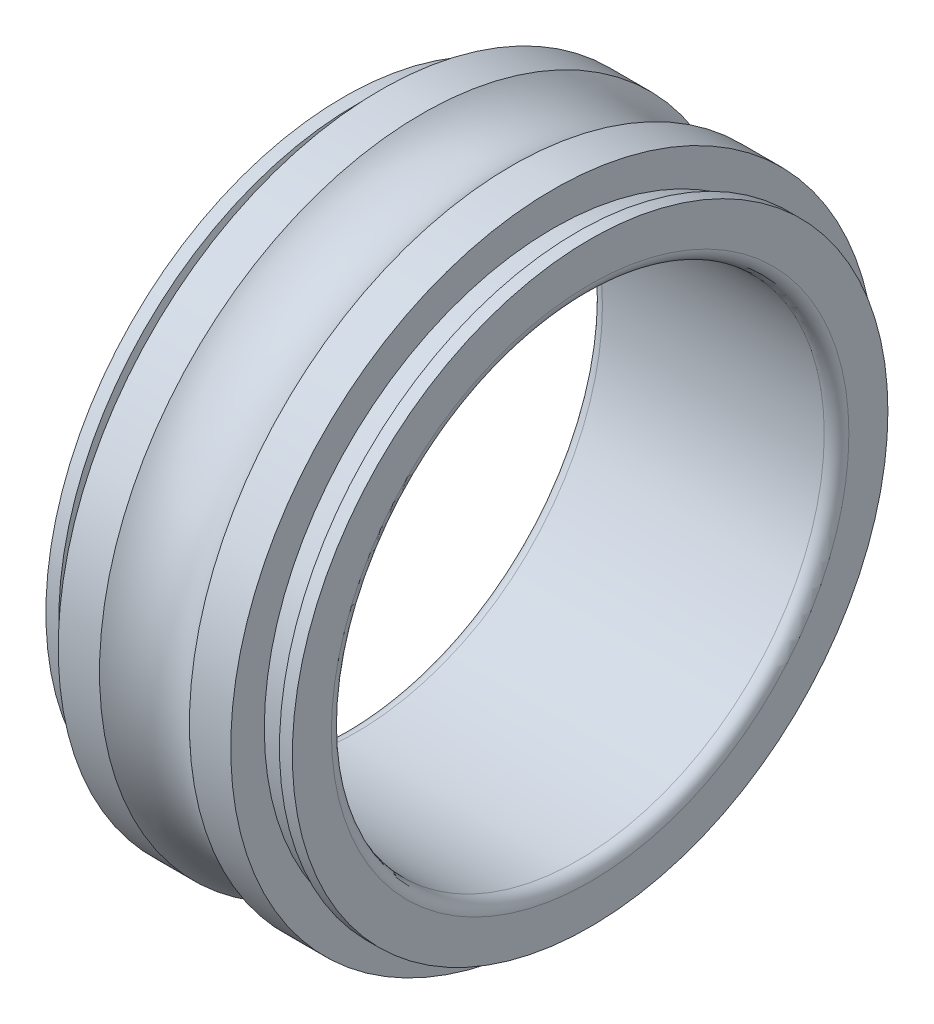
ISO-10303-21;
HEADER;
FILE_DESCRIPTION(('STEP AP214'),'2;1');
FILE_NAME('part.step','',(''),(''),'','','');
FILE_SCHEMA(('AUTOMOTIVE_DESIGN { 1 0 10303 214 1 1 1 1 }'));
ENDSEC;
DATA;
#1=APPLICATION_CONTEXT('core data for automotive mechanical design processes');
#2=APPLICATION_PROTOCOL_DEFINITION('international standard','automotive_design',2000,#1);
#3=PRODUCT_CONTEXT('',#1,'mechanical');
#4=PRODUCT('Part','Part','',(#3));
#5=PRODUCT_RELATED_PRODUCT_CATEGORY('part','',(#4));
#6=PRODUCT_DEFINITION_FORMATION('','',#4);
#7=PRODUCT_DEFINITION_CONTEXT('part definition',#1,'design');
#8=PRODUCT_DEFINITION('design','',#6,#7);
#9=PRODUCT_DEFINITION_SHAPE('','',#8);
#10=(LENGTH_UNIT() NAMED_UNIT(*) SI_UNIT(.MILLI.,.METRE.));
#11=(NAMED_UNIT(*) PLANE_ANGLE_UNIT() SI_UNIT($,.RADIAN.));
#12=(NAMED_UNIT(*) SI_UNIT($,.STERADIAN.) SOLID_ANGLE_UNIT());
#13=UNCERTAINTY_MEASURE_WITH_UNIT(LENGTH_MEASURE(1.E-05),#10,'distance_accuracy_value','');
#14=(GEOMETRIC_REPRESENTATION_CONTEXT(3) GLOBAL_UNCERTAINTY_ASSIGNED_CONTEXT((#13)) GLOBAL_UNIT_ASSIGNED_CONTEXT((#10,
#11,#12)) REPRESENTATION_CONTEXT('',''));
#15=CARTESIAN_POINT('',(0.,0.,0.));
#16=DIRECTION('',(0.,0.,1.));
#17=DIRECTION('',(1.,0.,0.));
#18=AXIS2_PLACEMENT_3D('',#15,#16,#17);
#19=CARTESIAN_POINT('',(0.,7.25,0.));
#20=DIRECTION('',(-1.,0.,0.));
#21=DIRECTION('',(0.,0.,1.));
#22=AXIS2_PLACEMENT_3D('',#19,#20,#21);
#23=PLANE('',#22);
#24=CARTESIAN_POINT('',(0.,0.,0.));
#25=DIRECTION('',(1.,0.,0.));
#26=DIRECTION('',(0.,0.,-1.));
#27=AXIS2_PLACEMENT_3D('',#24,#25,#26);
#28=CIRCLE('',#27,6.3);
#29=CARTESIAN_POINT('',(0.,0.,-6.3));
#30=VERTEX_POINT('',#29);
#31=EDGE_CURVE('E70',#30,#30,#28,.T.);
#32=ORIENTED_EDGE('',*,*,#31,.T.);
#33=EDGE_LOOP('',(#32));
#34=FACE_BOUND('',#33,.T.);
#35=CARTESIAN_POINT('',(0.,0.,0.));
#36=DIRECTION('',(1.,0.,0.));
#37=DIRECTION('',(0.,0.,-1.));
#38=AXIS2_PLACEMENT_3D('',#35,#36,#37);
#39=CIRCLE('',#38,7.25);
#40=CARTESIAN_POINT('',(0.,0.,-7.25));
#41=VERTEX_POINT('',#40);
#42=EDGE_CURVE('E63',#41,#41,#39,.T.);
#43=ORIENTED_EDGE('',*,*,#42,.F.);
#44=EDGE_LOOP('',(#43));
#45=FACE_BOUND('',#44,.T.);
#46=ADVANCED_FACE('F14',(#34,#45),#23,.T.);
#47=CARTESIAN_POINT('',(0.299999999999939,0.,0.));
#48=DIRECTION('',(1.,0.,0.));
#49=DIRECTION('',(0.,0.,-1.));
#50=AXIS2_PLACEMENT_3D('',#47,#48,#49);
#51=TOROIDAL_SURFACE('',#50,6.3,0.299999999999939);
#52=CARTESIAN_POINT('',(0.3,0.,0.));
#53=DIRECTION('',(1.,0.,0.));
#54=DIRECTION('',(0.,0.,-1.));
#55=AXIS2_PLACEMENT_3D('',#52,#53,#54);
#56=CIRCLE('',#55,6.);
#57=CARTESIAN_POINT('',(0.3,0.,-6.));
#58=VERTEX_POINT('',#57);
#59=EDGE_CURVE('E61',#58,#58,#56,.T.);
#60=ORIENTED_EDGE('',*,*,#59,.T.);
#61=EDGE_LOOP('',(#60));
#62=FACE_BOUND('',#61,.T.);
#63=ORIENTED_EDGE('',*,*,#31,.F.);
#64=EDGE_LOOP('',(#63));
#65=FACE_BOUND('',#64,.T.);
#66=ADVANCED_FACE('F73',(#62,#65),#51,.T.);
#67=CARTESIAN_POINT('',(6.,0.,0.));
#68=DIRECTION('',(1.,0.,0.));
#69=DIRECTION('',(0.,0.,-1.));
#70=AXIS2_PLACEMENT_3D('',#67,#68,#69);
#71=CYLINDRICAL_SURFACE('',#70,6.);
#72=CARTESIAN_POINT('',(5.7,0.,0.));
#73=DIRECTION('',(1.,0.,0.));
#74=DIRECTION('',(0.,0.,-1.));
#75=AXIS2_PLACEMENT_3D('',#72,#73,#74);
#76=CIRCLE('',#75,6.);
#77=CARTESIAN_POINT('',(5.7,0.,-6.));
#78=VERTEX_POINT('',#77);
#79=EDGE_CURVE('E59',#78,#78,#76,.T.);
#80=ORIENTED_EDGE('',*,*,#79,.T.);
#81=EDGE_LOOP('',(#80));
#82=FACE_BOUND('',#81,.T.);
#83=ORIENTED_EDGE('',*,*,#59,.F.);
#84=EDGE_LOOP('',(#83));
#85=FACE_BOUND('',#84,.T.);
#86=ADVANCED_FACE('F74',(#82,#85),#71,.F.);
#87=CARTESIAN_POINT('',(5.70000000000012,0.,0.));
#88=DIRECTION('',(1.,0.,0.));
#89=DIRECTION('',(0.,0.,-1.));
#90=AXIS2_PLACEMENT_3D('',#87,#88,#89);
#91=TOROIDAL_SURFACE('',#90,6.29999999999988,0.299999999999876);
#92=CARTESIAN_POINT('',(6.,0.,0.));
#93=DIRECTION('',(1.,0.,0.));
#94=DIRECTION('',(0.,0.,-1.));
#95=AXIS2_PLACEMENT_3D('',#92,#93,#94);
#96=CIRCLE('',#95,6.29999999999988);
#97=CARTESIAN_POINT('',(6.,0.,-6.29999999999988));
#98=VERTEX_POINT('',#97);
#99=EDGE_CURVE('E54',#98,#98,#96,.T.);
#100=ORIENTED_EDGE('',*,*,#99,.T.);
#101=EDGE_LOOP('',(#100));
#102=FACE_BOUND('',#101,.T.);
#103=ORIENTED_EDGE('',*,*,#79,.F.);
#104=EDGE_LOOP('',(#103));
#105=FACE_BOUND('',#104,.T.);
#106=ADVANCED_FACE('F84',(#102,#105),#91,.T.);
#107=CARTESIAN_POINT('',(6.,6.3,0.));
#108=DIRECTION('',(1.,0.,0.));
#109=DIRECTION('',(0.,0.,-1.));
#110=AXIS2_PLACEMENT_3D('',#107,#108,#109);
#111=PLANE('',#110);
#112=CARTESIAN_POINT('',(6.,0.,0.));
#113=DIRECTION('',(1.,0.,0.));
#114=DIRECTION('',(0.,0.,-1.));
#115=AXIS2_PLACEMENT_3D('',#112,#113,#114);
#116=CIRCLE('',#115,7.25);
#117=CARTESIAN_POINT('',(6.,0.,-7.25));
#118=VERTEX_POINT('',#117);
#119=EDGE_CURVE('E55',#118,#118,#116,.T.);
#120=ORIENTED_EDGE('',*,*,#119,.T.);
#121=EDGE_LOOP('',(#120));
#122=FACE_BOUND('',#121,.T.);
#123=ORIENTED_EDGE('',*,*,#99,.F.);
#124=EDGE_LOOP('',(#123));
#125=FACE_BOUND('',#124,.T.);
#126=ADVANCED_FACE('F89',(#122,#125),#111,.T.);
#127=CARTESIAN_POINT('',(6.,0.,0.));
#128=DIRECTION('',(1.,0.,0.));
#129=DIRECTION('',(0.,0.,-1.));
#130=AXIS2_PLACEMENT_3D('',#127,#128,#129);
#131=CYLINDRICAL_SURFACE('',#130,7.25);
#132=CARTESIAN_POINT('',(5.6868911086754,0.,0.));
#133=DIRECTION('',(1.,0.,0.));
#134=DIRECTION('',(0.,0.,-1.));
#135=AXIS2_PLACEMENT_3D('',#132,#133,#134);
#136=CIRCLE('',#135,7.25);
#137=CARTESIAN_POINT('',(5.6868911086754,0.,-7.25));
#138=VERTEX_POINT('',#137);
#139=EDGE_CURVE('E47',#138,#138,#136,.T.);
#140=ORIENTED_EDGE('',*,*,#139,.T.);
#141=EDGE_LOOP('',(#140));
#142=FACE_BOUND('',#141,.T.);
#143=ORIENTED_EDGE('',*,*,#119,.F.);
#144=EDGE_LOOP('',(#143));
#145=FACE_BOUND('',#144,.T.);
#146=ADVANCED_FACE('F94',(#142,#145),#131,.T.);
#147=CARTESIAN_POINT('',(5.6868911086754,0.,0.));
#148=DIRECTION('',(1.,0.,0.));
#149=DIRECTION('',(0.,0.,-1.));
#150=AXIS2_PLACEMENT_3D('',#147,#148,#149);
#151=CONICAL_SURFACE('',#150,7.25,1.30899693899604);
#152=CARTESIAN_POINT('',(5.6286121593217,0.,0.));
#153=DIRECTION('',(1.,0.,0.));
#154=DIRECTION('',(0.,0.,-1.));
#155=AXIS2_PLACEMENT_3D('',#152,#153,#154);
#156=CIRCLE('',#155,7.0325);
#157=CARTESIAN_POINT('',(5.6286121593217,0.,-7.0325));
#158=VERTEX_POINT('',#157);
#159=EDGE_CURVE('E46',#158,#158,#156,.T.);
#160=ORIENTED_EDGE('',*,*,#159,.T.);
#161=EDGE_LOOP('',(#160));
#162=FACE_BOUND('',#161,.T.);
#163=ORIENTED_EDGE('',*,*,#139,.F.);
#164=EDGE_LOOP('',(#163));
#165=FACE_BOUND('',#164,.T.);
#166=ADVANCED_FACE('F98',(#162,#165),#151,.T.);
#167=CARTESIAN_POINT('',(6.,0.,0.));
#168=DIRECTION('',(1.,0.,0.));
#169=DIRECTION('',(0.,0.,-1.));
#170=AXIS2_PLACEMENT_3D('',#167,#168,#169);
#171=CYLINDRICAL_SURFACE('',#170,7.0325);
#172=CARTESIAN_POINT('',(5.1,0.,0.));
#173=DIRECTION('',(1.,0.,0.));
#174=DIRECTION('',(0.,0.,-1.));
#175=AXIS2_PLACEMENT_3D('',#172,#173,#174);
#176=CIRCLE('',#175,7.0325);
#177=CARTESIAN_POINT('',(5.1,0.,-7.0325));
#178=VERTEX_POINT('',#177);
#179=EDGE_CURVE('E43',#178,#178,#176,.T.);
#180=ORIENTED_EDGE('',*,*,#179,.T.);
#181=EDGE_LOOP('',(#180));
#182=FACE_BOUND('',#181,.T.);
#183=ORIENTED_EDGE('',*,*,#159,.F.);
#184=EDGE_LOOP('',(#183));
#185=FACE_BOUND('',#184,.T.);
#186=ADVANCED_FACE('F105',(#182,#185),#171,.T.);
#187=CARTESIAN_POINT('',(5.1,7.0325,0.));
#188=DIRECTION('',(1.,0.,0.));
#189=DIRECTION('',(0.,0.,-1.));
#190=AXIS2_PLACEMENT_3D('',#187,#188,#189);
#191=PLANE('',#190);
#192=CARTESIAN_POINT('',(5.1,0.,0.));
#193=DIRECTION('',(1.,0.,0.));
#194=DIRECTION('',(0.,0.,-1.));
#195=AXIS2_PLACEMENT_3D('',#192,#193,#194);
#196=CIRCLE('',#195,7.85);
#197=CARTESIAN_POINT('',(5.1,0.,-7.85));
#198=VERTEX_POINT('',#197);
#199=EDGE_CURVE('E37',#198,#198,#196,.T.);
#200=ORIENTED_EDGE('',*,*,#199,.T.);
#201=EDGE_LOOP('',(#200));
#202=FACE_BOUND('',#201,.T.);
#203=ORIENTED_EDGE('',*,*,#179,.F.);
#204=EDGE_LOOP('',(#203));
#205=FACE_BOUND('',#204,.T.);
#206=ADVANCED_FACE('F106',(#202,#205),#191,.T.);
#207=CARTESIAN_POINT('',(6.,0.,0.));
#208=DIRECTION('',(1.,0.,0.));
#209=DIRECTION('',(0.,0.,-1.));
#210=AXIS2_PLACEMENT_3D('',#207,#208,#209);
#211=CYLINDRICAL_SURFACE('',#210,7.85);
#212=CARTESIAN_POINT('',(4.0943748215305,0.,0.));
#213=DIRECTION('',(1.,0.,0.));
#214=DIRECTION('',(0.,0.,-1.));
#215=AXIS2_PLACEMENT_3D('',#212,#213,#214);
#216=CIRCLE('',#215,7.85);
#217=CARTESIAN_POINT('',(4.0943748215305,0.,-7.85));
#218=VERTEX_POINT('',#217);
#219=EDGE_CURVE('E40',#218,#218,#216,.T.);
#220=ORIENTED_EDGE('',*,*,#219,.T.);
#221=EDGE_LOOP('',(#220));
#222=FACE_BOUND('',#221,.T.);
#223=ORIENTED_EDGE('',*,*,#199,.F.);
#224=EDGE_LOOP('',(#223));
#225=FACE_BOUND('',#224,.T.);
#226=ADVANCED_FACE('F109',(#222,#225),#211,.T.);
#227=CARTESIAN_POINT('',(3.,0.,0.));
#228=DIRECTION('',(1.,0.,0.));
#229=DIRECTION('',(0.,0.,-1.));
#230=AXIS2_PLACEMENT_3D('',#227,#228,#229);
#231=TOROIDAL_SURFACE('',#230,8.9999999999999,1.5874999999999);
#232=ORIENTED_EDGE('',*,*,#219,.F.);
#233=EDGE_LOOP('',(#232));
#234=FACE_BOUND('',#233,.T.);
#235=CARTESIAN_POINT('',(1.9056251784695,0.,0.));
#236=DIRECTION('',(1.,0.,0.));
#237=DIRECTION('',(0.,0.,-1.));
#238=AXIS2_PLACEMENT_3D('',#235,#236,#237);
#239=CIRCLE('',#238,7.85);
#240=CARTESIAN_POINT('',(1.9056251784695,0.,-7.85));
#241=VERTEX_POINT('',#240);
#242=EDGE_CURVE('E35',#241,#241,#239,.T.);
#243=ORIENTED_EDGE('',*,*,#242,.T.);
#244=EDGE_LOOP('',(#243));
#245=FACE_BOUND('',#244,.T.);
#246=ADVANCED_FACE('F111',(#234,#245),#231,.F.);
#247=CARTESIAN_POINT('',(6.,0.,0.));
#248=DIRECTION('',(1.,0.,0.));
#249=DIRECTION('',(0.,0.,-1.));
#250=AXIS2_PLACEMENT_3D('',#247,#248,#249);
#251=CYLINDRICAL_SURFACE('',#250,7.85);
#252=CARTESIAN_POINT('',(0.9,0.,0.));
#253=DIRECTION('',(1.,0.,0.));
#254=DIRECTION('',(0.,0.,-1.));
#255=AXIS2_PLACEMENT_3D('',#252,#253,#254);
#256=CIRCLE('',#255,7.85);
#257=CARTESIAN_POINT('',(0.9,0.,-7.85));
#258=VERTEX_POINT('',#257);
#259=EDGE_CURVE('E26',#258,#258,#256,.T.);
#260=ORIENTED_EDGE('',*,*,#259,.T.);
#261=EDGE_LOOP('',(#260));
#262=FACE_BOUND('',#261,.T.);
#263=ORIENTED_EDGE('',*,*,#242,.F.);
#264=EDGE_LOOP('',(#263));
#265=FACE_BOUND('',#264,.T.);
#266=ADVANCED_FACE('F119',(#262,#265),#251,.T.);
#267=CARTESIAN_POINT('',(0.9,7.85,0.));
#268=DIRECTION('',(-1.,0.,0.));
#269=DIRECTION('',(0.,0.,1.));
#270=AXIS2_PLACEMENT_3D('',#267,#268,#269);
#271=PLANE('',#270);
#272=CARTESIAN_POINT('',(0.9,0.,0.));
#273=DIRECTION('',(1.,0.,0.));
#274=DIRECTION('',(0.,0.,-1.));
#275=AXIS2_PLACEMENT_3D('',#272,#273,#274);
#276=CIRCLE('',#275,7.0325);
#277=CARTESIAN_POINT('',(0.9,0.,-7.0325));
#278=VERTEX_POINT('',#277);
#279=EDGE_CURVE('E25',#278,#278,#276,.T.);
#280=ORIENTED_EDGE('',*,*,#279,.T.);
#281=EDGE_LOOP('',(#280));
#282=FACE_BOUND('',#281,.T.);
#283=ORIENTED_EDGE('',*,*,#259,.F.);
#284=EDGE_LOOP('',(#283));
#285=FACE_BOUND('',#284,.T.);
#286=ADVANCED_FACE('F125',(#282,#285),#271,.T.);
#287=CARTESIAN_POINT('',(6.,0.,0.));
#288=DIRECTION('',(1.,0.,0.));
#289=DIRECTION('',(0.,0.,-1.));
#290=AXIS2_PLACEMENT_3D('',#287,#288,#289);
#291=CYLINDRICAL_SURFACE('',#290,7.0325);
#292=CARTESIAN_POINT('',(0.37138784067832,0.,0.));
#293=DIRECTION('',(1.,0.,0.));
#294=DIRECTION('',(0.,0.,-1.));
#295=AXIS2_PLACEMENT_3D('',#292,#293,#294);
#296=CIRCLE('',#295,7.0325);
#297=CARTESIAN_POINT('',(0.37138784067832,0.,-7.0325));
#298=VERTEX_POINT('',#297);
#299=EDGE_CURVE('E21',#298,#298,#296,.T.);
#300=ORIENTED_EDGE('',*,*,#299,.T.);
#301=EDGE_LOOP('',(#300));
#302=FACE_BOUND('',#301,.T.);
#303=ORIENTED_EDGE('',*,*,#279,.F.);
#304=EDGE_LOOP('',(#303));
#305=FACE_BOUND('',#304,.T.);
#306=ADVANCED_FACE('F130',(#302,#305),#291,.T.);
#307=CARTESIAN_POINT('',(0.371387840678321,0.,0.));
#308=DIRECTION('',(-1.,0.,0.));
#309=DIRECTION('',(0.,0.,1.));
#310=AXIS2_PLACEMENT_3D('',#307,#308,#309);
#311=CONICAL_SURFACE('',#310,7.0325,1.30899693899574);
#312=CARTESIAN_POINT('',(0.31310889132455,0.,0.));
#313=DIRECTION('',(1.,0.,0.));
#314=DIRECTION('',(0.,0.,-1.));
#315=AXIS2_PLACEMENT_3D('',#312,#313,#314);
#316=CIRCLE('',#315,7.25);
#317=CARTESIAN_POINT('',(0.31310889132455,0.,-7.25));
#318=VERTEX_POINT('',#317);
#319=EDGE_CURVE('E10',#318,#318,#316,.T.);
#320=ORIENTED_EDGE('',*,*,#319,.T.);
#321=EDGE_LOOP('',(#320));
#322=FACE_BOUND('',#321,.T.);
#323=ORIENTED_EDGE('',*,*,#299,.F.);
#324=EDGE_LOOP('',(#323));
#325=FACE_BOUND('',#324,.T.);
#326=ADVANCED_FACE('F127',(#322,#325),#311,.T.);
#327=CARTESIAN_POINT('',(6.,0.,0.));
#328=DIRECTION('',(1.,0.,0.));
#329=DIRECTION('',(0.,0.,-1.));
#330=AXIS2_PLACEMENT_3D('',#327,#328,#329);
#331=CYLINDRICAL_SURFACE('',#330,7.25);
#332=ORIENTED_EDGE('',*,*,#42,.T.);
#333=EDGE_LOOP('',(#332));
#334=FACE_BOUND('',#333,.T.);
#335=ORIENTED_EDGE('',*,*,#319,.F.);
#336=EDGE_LOOP('',(#335));
#337=FACE_BOUND('',#336,.T.);
#338=ADVANCED_FACE('F16',(#334,#337),#331,.T.);
#339=CLOSED_SHELL('',(#46,#66,#86,#106,#126,#146,#166,#186,#206,#226,#246,#266,#286,#306,#326,#338));
#340=MANIFOLD_SOLID_BREP('B1',#339);
#341=ADVANCED_BREP_SHAPE_REPRESENTATION('',(#18,#340),#14);
#342=SHAPE_DEFINITION_REPRESENTATION(#9,#341);
ENDSEC;
END-ISO-10303-21;
